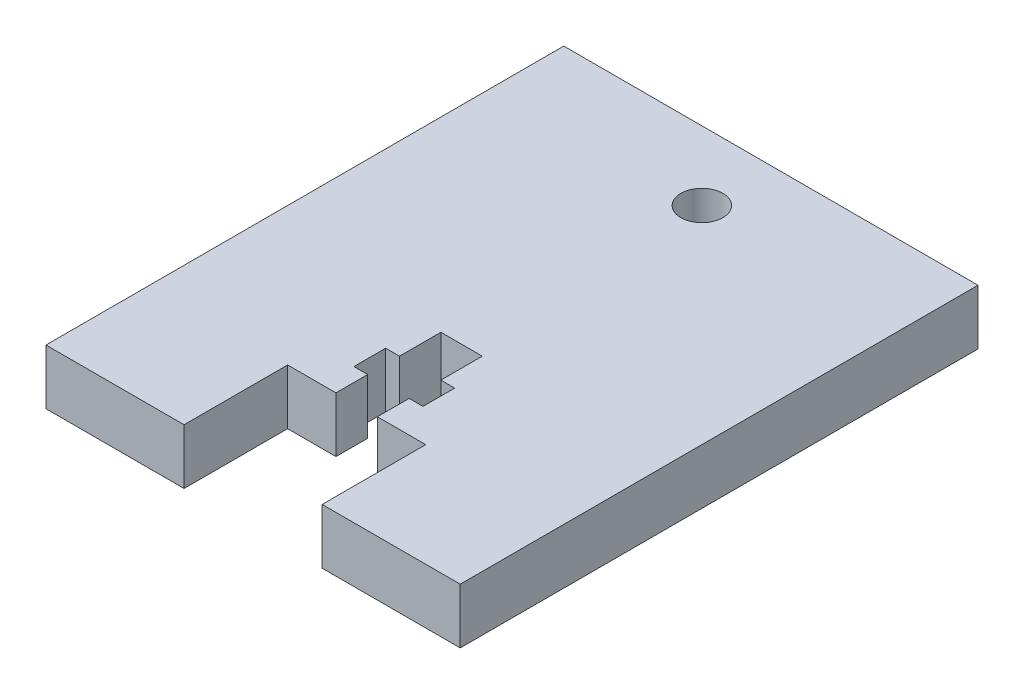
ISO-10303-21;
HEADER;
FILE_DESCRIPTION(('STEP AP214'),'2;1');
FILE_NAME('part.step','',(''),(''),'','','');
FILE_SCHEMA(('AUTOMOTIVE_DESIGN { 1 0 10303 214 1 1 1 1 }'));
ENDSEC;
DATA;
#1=APPLICATION_CONTEXT('core data for automotive mechanical design processes');
#2=APPLICATION_PROTOCOL_DEFINITION('international standard','automotive_design',2000,#1);
#3=PRODUCT_CONTEXT('',#1,'mechanical');
#4=PRODUCT('Part','Part','',(#3));
#5=PRODUCT_RELATED_PRODUCT_CATEGORY('part','',(#4));
#6=PRODUCT_DEFINITION_FORMATION('','',#4);
#7=PRODUCT_DEFINITION_CONTEXT('part definition',#1,'design');
#8=PRODUCT_DEFINITION('design','',#6,#7);
#9=PRODUCT_DEFINITION_SHAPE('','',#8);
#10=(LENGTH_UNIT() NAMED_UNIT(*) SI_UNIT(.MILLI.,.METRE.));
#11=(NAMED_UNIT(*) PLANE_ANGLE_UNIT() SI_UNIT($,.RADIAN.));
#12=(NAMED_UNIT(*) SI_UNIT($,.STERADIAN.) SOLID_ANGLE_UNIT());
#13=UNCERTAINTY_MEASURE_WITH_UNIT(LENGTH_MEASURE(1.E-05),#10,'distance_accuracy_value','');
#14=(GEOMETRIC_REPRESENTATION_CONTEXT(3) GLOBAL_UNCERTAINTY_ASSIGNED_CONTEXT((#13)) GLOBAL_UNIT_ASSIGNED_CONTEXT((#10,
#11,#12)) REPRESENTATION_CONTEXT('',''));
#15=CARTESIAN_POINT('',(0.,0.,0.));
#16=DIRECTION('',(0.,0.,1.));
#17=DIRECTION('',(1.,0.,0.));
#18=AXIS2_PLACEMENT_3D('',#15,#16,#17);
#19=CARTESIAN_POINT('',(0.,8.,0.));
#20=DIRECTION('',(0.,1.,0.));
#21=DIRECTION('',(0.,0.,1.));
#22=AXIS2_PLACEMENT_3D('',#19,#20,#21);
#23=PLANE('',#22);
#24=DIRECTION('',(0.,0.,-1.));
#25=VECTOR('',#24,1.);
#26=CARTESIAN_POINT('',(30.,8.,37.));
#27=LINE('',#26,#25);
#28=CARTESIAN_POINT('',(30.,8.,37.));
#29=VERTEX_POINT('',#28);
#30=CARTESIAN_POINT('',(30.,8.,-38.));
#31=VERTEX_POINT('',#30);
#32=EDGE_CURVE('E241',#29,#31,#27,.T.);
#33=ORIENTED_EDGE('',*,*,#32,.T.);
#34=DIRECTION('',(-1.,0.,0.));
#35=VECTOR('',#34,1.);
#36=CARTESIAN_POINT('',(30.,8.,-38.));
#37=LINE('',#36,#35);
#38=CARTESIAN_POINT('',(-30.,8.,-38.));
#39=VERTEX_POINT('',#38);
#40=EDGE_CURVE('E129',#31,#39,#37,.T.);
#41=ORIENTED_EDGE('',*,*,#40,.T.);
#42=DIRECTION('',(0.,0.,1.));
#43=VECTOR('',#42,1.);
#44=CARTESIAN_POINT('',(-30.,8.,37.));
#45=LINE('',#44,#43);
#46=CARTESIAN_POINT('',(-30.,8.,37.));
#47=VERTEX_POINT('',#46);
#48=EDGE_CURVE('E292',#39,#47,#45,.T.);
#49=ORIENTED_EDGE('',*,*,#48,.T.);
#50=DIRECTION('',(1.,0.,0.));
#51=VECTOR('',#50,1.);
#52=CARTESIAN_POINT('',(-10.,8.,37.));
#53=LINE('',#52,#51);
#54=CARTESIAN_POINT('',(-10.,8.,37.));
#55=VERTEX_POINT('',#54);
#56=EDGE_CURVE('E311',#47,#55,#53,.T.);
#57=ORIENTED_EDGE('',*,*,#56,.T.);
#58=DIRECTION('',(0.,0.,-1.));
#59=VECTOR('',#58,1.);
#60=CARTESIAN_POINT('',(-10.,8.,37.));
#61=LINE('',#60,#59);
#62=CARTESIAN_POINT('',(-10.,8.,22.));
#63=VERTEX_POINT('',#62);
#64=EDGE_CURVE('E308',#55,#63,#61,.T.);
#65=ORIENTED_EDGE('',*,*,#64,.T.);
#66=DIRECTION('',(1.,0.,0.));
#67=VECTOR('',#66,1.);
#68=CARTESIAN_POINT('',(-3.,8.,22.));
#69=LINE('',#68,#67);
#70=CARTESIAN_POINT('',(-3.,8.,22.));
#71=VERTEX_POINT('',#70);
#72=EDGE_CURVE('E310',#63,#71,#69,.T.);
#73=ORIENTED_EDGE('',*,*,#72,.T.);
#74=DIRECTION('',(0.,0.,-1.));
#75=VECTOR('',#74,1.);
#76=CARTESIAN_POINT('',(-3.,8.,17.4));
#77=LINE('',#76,#75);
#78=CARTESIAN_POINT('',(-3.,8.,17.4));
#79=VERTEX_POINT('',#78);
#80=EDGE_CURVE('E313',#71,#79,#77,.T.);
#81=ORIENTED_EDGE('',*,*,#80,.T.);
#82=DIRECTION('',(-1.,0.,0.));
#83=VECTOR('',#82,1.);
#84=CARTESIAN_POINT('',(-5.,8.,17.4));
#85=LINE('',#84,#83);
#86=CARTESIAN_POINT('',(-5.,8.,17.4));
#87=VERTEX_POINT('',#86);
#88=EDGE_CURVE('E319',#79,#87,#85,.T.);
#89=ORIENTED_EDGE('',*,*,#88,.T.);
#90=DIRECTION('',(0.,0.,-1.));
#91=VECTOR('',#90,1.);
#92=CARTESIAN_POINT('',(-5.,8.,12.8));
#93=LINE('',#92,#91);
#94=CARTESIAN_POINT('',(-5.,8.,12.8));
#95=VERTEX_POINT('',#94);
#96=EDGE_CURVE('E321',#87,#95,#93,.T.);
#97=ORIENTED_EDGE('',*,*,#96,.T.);
#98=DIRECTION('',(1.,0.,0.));
#99=VECTOR('',#98,1.);
#100=CARTESIAN_POINT('',(-5.,8.,12.8));
#101=LINE('',#100,#99);
#102=CARTESIAN_POINT('',(-3.,8.,12.8));
#103=VERTEX_POINT('',#102);
#104=EDGE_CURVE('E323',#95,#103,#101,.T.);
#105=ORIENTED_EDGE('',*,*,#104,.T.);
#106=DIRECTION('',(0.,0.,-1.));
#107=VECTOR('',#106,1.);
#108=CARTESIAN_POINT('',(-3.,8.,6.80000000000001));
#109=LINE('',#108,#107);
#110=CARTESIAN_POINT('',(-3.,8.,6.80000000000001));
#111=VERTEX_POINT('',#110);
#112=EDGE_CURVE('E325',#103,#111,#109,.T.);
#113=ORIENTED_EDGE('',*,*,#112,.T.);
#114=DIRECTION('',(1.,0.,0.));
#115=VECTOR('',#114,1.);
#116=CARTESIAN_POINT('',(3.,8.,6.80000000000001));
#117=LINE('',#116,#115);
#118=CARTESIAN_POINT('',(3.,8.,6.80000000000001));
#119=VERTEX_POINT('',#118);
#120=EDGE_CURVE('E327',#111,#119,#117,.T.);
#121=ORIENTED_EDGE('',*,*,#120,.T.);
#122=DIRECTION('',(0.,0.,1.));
#123=VECTOR('',#122,1.);
#124=CARTESIAN_POINT('',(3.,8.,12.8));
#125=LINE('',#124,#123);
#126=CARTESIAN_POINT('',(3.,8.,12.8));
#127=VERTEX_POINT('',#126);
#128=EDGE_CURVE('E329',#119,#127,#125,.T.);
#129=ORIENTED_EDGE('',*,*,#128,.T.);
#130=DIRECTION('',(1.,0.,0.));
#131=VECTOR('',#130,1.);
#132=CARTESIAN_POINT('',(3.,8.,12.8));
#133=LINE('',#132,#131);
#134=CARTESIAN_POINT('',(5.,8.,12.8));
#135=VERTEX_POINT('',#134);
#136=EDGE_CURVE('E331',#127,#135,#133,.T.);
#137=ORIENTED_EDGE('',*,*,#136,.T.);
#138=DIRECTION('',(0.,0.,1.));
#139=VECTOR('',#138,1.);
#140=CARTESIAN_POINT('',(5.,8.,12.8));
#141=LINE('',#140,#139);
#142=CARTESIAN_POINT('',(5.,8.,17.4));
#143=VERTEX_POINT('',#142);
#144=EDGE_CURVE('E333',#135,#143,#141,.T.);
#145=ORIENTED_EDGE('',*,*,#144,.T.);
#146=DIRECTION('',(-1.,0.,0.));
#147=VECTOR('',#146,1.);
#148=CARTESIAN_POINT('',(5.,8.,17.4));
#149=LINE('',#148,#147);
#150=CARTESIAN_POINT('',(3.,8.,17.4));
#151=VERTEX_POINT('',#150);
#152=EDGE_CURVE('E335',#143,#151,#149,.T.);
#153=ORIENTED_EDGE('',*,*,#152,.T.);
#154=DIRECTION('',(0.,0.,1.));
#155=VECTOR('',#154,1.);
#156=CARTESIAN_POINT('',(3.,8.,17.4));
#157=LINE('',#156,#155);
#158=CARTESIAN_POINT('',(3.,8.,22.));
#159=VERTEX_POINT('',#158);
#160=EDGE_CURVE('E184',#151,#159,#157,.T.);
#161=ORIENTED_EDGE('',*,*,#160,.T.);
#162=DIRECTION('',(1.,0.,0.));
#163=VECTOR('',#162,1.);
#164=CARTESIAN_POINT('',(10.,8.,22.));
#165=LINE('',#164,#163);
#166=CARTESIAN_POINT('',(10.,8.,22.));
#167=VERTEX_POINT('',#166);
#168=EDGE_CURVE('E178',#159,#167,#165,.T.);
#169=ORIENTED_EDGE('',*,*,#168,.T.);
#170=DIRECTION('',(0.,0.,1.));
#171=VECTOR('',#170,1.);
#172=CARTESIAN_POINT('',(10.,8.,37.));
#173=LINE('',#172,#171);
#174=CARTESIAN_POINT('',(10.,8.,37.));
#175=VERTEX_POINT('',#174);
#176=EDGE_CURVE('E182',#167,#175,#173,.T.);
#177=ORIENTED_EDGE('',*,*,#176,.T.);
#178=DIRECTION('',(1.,0.,0.));
#179=VECTOR('',#178,1.);
#180=CARTESIAN_POINT('',(10.,8.,37.));
#181=LINE('',#180,#179);
#182=EDGE_CURVE('E50',#175,#29,#181,.T.);
#183=ORIENTED_EDGE('',*,*,#182,.T.);
#184=EDGE_LOOP('',(#33,#41,#49,#57,#65,#73,#81,#89,#97,#105,#113,#121,#129,#137,#145,#153,#161,
#169,#177,#183));
#185=FACE_BOUND('',#184,.T.);
#186=CARTESIAN_POINT('',(0.,8.,-28.));
#187=DIRECTION('',(0.,1.,0.));
#188=DIRECTION('',(0.,0.,1.));
#189=AXIS2_PLACEMENT_3D('',#186,#187,#188);
#190=CIRCLE('',#189,3.05);
#191=CARTESIAN_POINT('',(0.,8.,-24.95));
#192=VERTEX_POINT('',#191);
#193=EDGE_CURVE('E206',#192,#192,#190,.T.);
#194=ORIENTED_EDGE('',*,*,#193,.F.);
#195=EDGE_LOOP('',(#194));
#196=FACE_BOUND('',#195,.T.);
#197=ADVANCED_FACE('F33',(#185,#196),#23,.T.);
#198=CARTESIAN_POINT('',(0.,0.,0.));
#199=DIRECTION('',(0.,1.,0.));
#200=DIRECTION('',(0.,0.,1.));
#201=AXIS2_PLACEMENT_3D('',#198,#199,#200);
#202=PLANE('',#201);
#203=DIRECTION('',(0.,0.,-1.));
#204=VECTOR('',#203,1.);
#205=CARTESIAN_POINT('',(30.,0.,37.));
#206=LINE('',#205,#204);
#207=CARTESIAN_POINT('',(30.,0.,37.));
#208=VERTEX_POINT('',#207);
#209=CARTESIAN_POINT('',(30.,0.,-38.));
#210=VERTEX_POINT('',#209);
#211=EDGE_CURVE('E202',#208,#210,#206,.T.);
#212=ORIENTED_EDGE('',*,*,#211,.F.);
#213=DIRECTION('',(1.,0.,0.));
#214=VECTOR('',#213,1.);
#215=CARTESIAN_POINT('',(10.,0.,37.));
#216=LINE('',#215,#214);
#217=CARTESIAN_POINT('',(10.,0.,37.));
#218=VERTEX_POINT('',#217);
#219=EDGE_CURVE('E121',#218,#208,#216,.T.);
#220=ORIENTED_EDGE('',*,*,#219,.F.);
#221=DIRECTION('',(0.,0.,1.));
#222=VECTOR('',#221,1.);
#223=CARTESIAN_POINT('',(10.,0.,37.));
#224=LINE('',#223,#222);
#225=CARTESIAN_POINT('',(10.,0.,22.));
#226=VERTEX_POINT('',#225);
#227=EDGE_CURVE('E115',#226,#218,#224,.T.);
#228=ORIENTED_EDGE('',*,*,#227,.F.);
#229=DIRECTION('',(1.,0.,0.));
#230=VECTOR('',#229,1.);
#231=CARTESIAN_POINT('',(10.,0.,22.));
#232=LINE('',#231,#230);
#233=CARTESIAN_POINT('',(3.,0.,22.));
#234=VERTEX_POINT('',#233);
#235=EDGE_CURVE('E192',#234,#226,#232,.T.);
#236=ORIENTED_EDGE('',*,*,#235,.F.);
#237=DIRECTION('',(0.,0.,1.));
#238=VECTOR('',#237,1.);
#239=CARTESIAN_POINT('',(3.,0.,17.4));
#240=LINE('',#239,#238);
#241=CARTESIAN_POINT('',(3.,0.,17.4));
#242=VERTEX_POINT('',#241);
#243=EDGE_CURVE('E236',#242,#234,#240,.T.);
#244=ORIENTED_EDGE('',*,*,#243,.F.);
#245=DIRECTION('',(-1.,0.,0.));
#246=VECTOR('',#245,1.);
#247=CARTESIAN_POINT('',(5.,0.,17.4));
#248=LINE('',#247,#246);
#249=CARTESIAN_POINT('',(5.,0.,17.4));
#250=VERTEX_POINT('',#249);
#251=EDGE_CURVE('E234',#250,#242,#248,.T.);
#252=ORIENTED_EDGE('',*,*,#251,.F.);
#253=DIRECTION('',(0.,0.,1.));
#254=VECTOR('',#253,1.);
#255=CARTESIAN_POINT('',(5.,0.,12.8));
#256=LINE('',#255,#254);
#257=CARTESIAN_POINT('',(5.,0.,12.8));
#258=VERTEX_POINT('',#257);
#259=EDGE_CURVE('E232',#258,#250,#256,.T.);
#260=ORIENTED_EDGE('',*,*,#259,.F.);
#261=DIRECTION('',(1.,0.,0.));
#262=VECTOR('',#261,1.);
#263=CARTESIAN_POINT('',(3.,0.,12.8));
#264=LINE('',#263,#262);
#265=CARTESIAN_POINT('',(3.,0.,12.8));
#266=VERTEX_POINT('',#265);
#267=EDGE_CURVE('E230',#266,#258,#264,.T.);
#268=ORIENTED_EDGE('',*,*,#267,.F.);
#269=DIRECTION('',(0.,0.,1.));
#270=VECTOR('',#269,1.);
#271=CARTESIAN_POINT('',(3.,0.,12.8));
#272=LINE('',#271,#270);
#273=CARTESIAN_POINT('',(3.,0.,6.80000000000001));
#274=VERTEX_POINT('',#273);
#275=EDGE_CURVE('E228',#274,#266,#272,.T.);
#276=ORIENTED_EDGE('',*,*,#275,.F.);
#277=DIRECTION('',(1.,0.,0.));
#278=VECTOR('',#277,1.);
#279=CARTESIAN_POINT('',(3.,0.,6.80000000000001));
#280=LINE('',#279,#278);
#281=CARTESIAN_POINT('',(-3.,0.,6.80000000000001));
#282=VERTEX_POINT('',#281);
#283=EDGE_CURVE('E226',#282,#274,#280,.T.);
#284=ORIENTED_EDGE('',*,*,#283,.F.);
#285=DIRECTION('',(0.,0.,-1.));
#286=VECTOR('',#285,1.);
#287=CARTESIAN_POINT('',(-3.,0.,6.80000000000001));
#288=LINE('',#287,#286);
#289=CARTESIAN_POINT('',(-3.,0.,12.8));
#290=VERTEX_POINT('',#289);
#291=EDGE_CURVE('E224',#290,#282,#288,.T.);
#292=ORIENTED_EDGE('',*,*,#291,.F.);
#293=DIRECTION('',(1.,0.,0.));
#294=VECTOR('',#293,1.);
#295=CARTESIAN_POINT('',(-5.,0.,12.8));
#296=LINE('',#295,#294);
#297=CARTESIAN_POINT('',(-5.,0.,12.8));
#298=VERTEX_POINT('',#297);
#299=EDGE_CURVE('E222',#298,#290,#296,.T.);
#300=ORIENTED_EDGE('',*,*,#299,.F.);
#301=DIRECTION('',(0.,0.,-1.));
#302=VECTOR('',#301,1.);
#303=CARTESIAN_POINT('',(-5.,0.,12.8));
#304=LINE('',#303,#302);
#305=CARTESIAN_POINT('',(-5.,0.,17.4));
#306=VERTEX_POINT('',#305);
#307=EDGE_CURVE('E220',#306,#298,#304,.T.);
#308=ORIENTED_EDGE('',*,*,#307,.F.);
#309=DIRECTION('',(-1.,0.,0.));
#310=VECTOR('',#309,1.);
#311=CARTESIAN_POINT('',(-5.,0.,17.4));
#312=LINE('',#311,#310);
#313=CARTESIAN_POINT('',(-3.,0.,17.4));
#314=VERTEX_POINT('',#313);
#315=EDGE_CURVE('E218',#314,#306,#312,.T.);
#316=ORIENTED_EDGE('',*,*,#315,.F.);
#317=DIRECTION('',(0.,0.,-1.));
#318=VECTOR('',#317,1.);
#319=CARTESIAN_POINT('',(-3.,0.,17.4));
#320=LINE('',#319,#318);
#321=CARTESIAN_POINT('',(-3.,0.,22.));
#322=VERTEX_POINT('',#321);
#323=EDGE_CURVE('E216',#322,#314,#320,.T.);
#324=ORIENTED_EDGE('',*,*,#323,.F.);
#325=DIRECTION('',(1.,0.,0.));
#326=VECTOR('',#325,1.);
#327=CARTESIAN_POINT('',(-3.,0.,22.));
#328=LINE('',#327,#326);
#329=CARTESIAN_POINT('',(-10.,0.,22.));
#330=VERTEX_POINT('',#329);
#331=EDGE_CURVE('E214',#330,#322,#328,.T.);
#332=ORIENTED_EDGE('',*,*,#331,.F.);
#333=DIRECTION('',(0.,0.,-1.));
#334=VECTOR('',#333,1.);
#335=CARTESIAN_POINT('',(-10.,0.,37.));
#336=LINE('',#335,#334);
#337=CARTESIAN_POINT('',(-10.,0.,37.));
#338=VERTEX_POINT('',#337);
#339=EDGE_CURVE('E212',#338,#330,#336,.T.);
#340=ORIENTED_EDGE('',*,*,#339,.F.);
#341=DIRECTION('',(1.,0.,0.));
#342=VECTOR('',#341,1.);
#343=CARTESIAN_POINT('',(-10.,0.,37.));
#344=LINE('',#343,#342);
#345=CARTESIAN_POINT('',(-30.,0.,37.));
#346=VERTEX_POINT('',#345);
#347=EDGE_CURVE('E210',#346,#338,#344,.T.);
#348=ORIENTED_EDGE('',*,*,#347,.F.);
#349=DIRECTION('',(0.,0.,1.));
#350=VECTOR('',#349,1.);
#351=CARTESIAN_POINT('',(-30.,0.,37.));
#352=LINE('',#351,#350);
#353=CARTESIAN_POINT('',(-30.,0.,-38.));
#354=VERTEX_POINT('',#353);
#355=EDGE_CURVE('E208',#354,#346,#352,.T.);
#356=ORIENTED_EDGE('',*,*,#355,.F.);
#357=DIRECTION('',(-1.,0.,0.));
#358=VECTOR('',#357,1.);
#359=CARTESIAN_POINT('',(30.,0.,-38.));
#360=LINE('',#359,#358);
#361=EDGE_CURVE('E205',#210,#354,#360,.T.);
#362=ORIENTED_EDGE('',*,*,#361,.F.);
#363=EDGE_LOOP('',(#212,#220,#228,#236,#244,#252,#260,#268,#276,#284,#292,#300,#308,#316,#324,
#332,#340,#348,#356,#362));
#364=FACE_BOUND('',#363,.T.);
#365=CARTESIAN_POINT('',(0.,0.,-28.));
#366=DIRECTION('',(0.,1.,0.));
#367=DIRECTION('',(0.,0.,1.));
#368=AXIS2_PLACEMENT_3D('',#365,#366,#367);
#369=CIRCLE('',#368,3.05);
#370=CARTESIAN_POINT('',(0.,0.,-24.95));
#371=VERTEX_POINT('',#370);
#372=EDGE_CURVE('E586',#371,#371,#369,.T.);
#373=ORIENTED_EDGE('',*,*,#372,.T.);
#374=EDGE_LOOP('',(#373));
#375=FACE_BOUND('',#374,.T.);
#376=ADVANCED_FACE('F296',(#364,#375),#202,.F.);
#377=CARTESIAN_POINT('',(30.,8.,37.));
#378=DIRECTION('',(-1.,0.,0.));
#379=DIRECTION('',(0.,0.,1.));
#380=AXIS2_PLACEMENT_3D('',#377,#378,#379);
#381=PLANE('',#380);
#382=ORIENTED_EDGE('',*,*,#211,.T.);
#383=DIRECTION('',(0.,-1.,0.));
#384=VECTOR('',#383,1.);
#385=CARTESIAN_POINT('',(30.,8.,-38.));
#386=LINE('',#385,#384);
#387=EDGE_CURVE('E11',#31,#210,#386,.T.);
#388=ORIENTED_EDGE('',*,*,#387,.F.);
#389=ORIENTED_EDGE('',*,*,#32,.F.);
#390=DIRECTION('',(0.,-1.,0.));
#391=VECTOR('',#390,1.);
#392=CARTESIAN_POINT('',(30.,8.,37.));
#393=LINE('',#392,#391);
#394=EDGE_CURVE('E198',#29,#208,#393,.T.);
#395=ORIENTED_EDGE('',*,*,#394,.T.);
#396=EDGE_LOOP('',(#382,#388,#389,#395));
#397=FACE_BOUND('',#396,.T.);
#398=ADVANCED_FACE('F35',(#397),#381,.F.);
#399=CARTESIAN_POINT('',(30.,8.,-38.));
#400=DIRECTION('',(0.,0.,1.));
#401=DIRECTION('',(1.,0.,0.));
#402=AXIS2_PLACEMENT_3D('',#399,#400,#401);
#403=PLANE('',#402);
#404=ORIENTED_EDGE('',*,*,#361,.T.);
#405=DIRECTION('',(0.,-1.,0.));
#406=VECTOR('',#405,1.);
#407=CARTESIAN_POINT('',(-30.,8.,-38.));
#408=LINE('',#407,#406);
#409=EDGE_CURVE('E42',#39,#354,#408,.T.);
#410=ORIENTED_EDGE('',*,*,#409,.F.);
#411=ORIENTED_EDGE('',*,*,#40,.F.);
#412=ORIENTED_EDGE('',*,*,#387,.T.);
#413=EDGE_LOOP('',(#404,#410,#411,#412));
#414=FACE_BOUND('',#413,.T.);
#415=ADVANCED_FACE('F369',(#414),#403,.F.);
#416=CARTESIAN_POINT('',(-30.,8.,37.));
#417=DIRECTION('',(1.,0.,0.));
#418=DIRECTION('',(0.,0.,-1.));
#419=AXIS2_PLACEMENT_3D('',#416,#417,#418);
#420=PLANE('',#419);
#421=ORIENTED_EDGE('',*,*,#355,.T.);
#422=DIRECTION('',(0.,-1.,0.));
#423=VECTOR('',#422,1.);
#424=CARTESIAN_POINT('',(-30.,8.,37.));
#425=LINE('',#424,#423);
#426=EDGE_CURVE('E284',#47,#346,#425,.T.);
#427=ORIENTED_EDGE('',*,*,#426,.F.);
#428=ORIENTED_EDGE('',*,*,#48,.F.);
#429=ORIENTED_EDGE('',*,*,#409,.T.);
#430=EDGE_LOOP('',(#421,#427,#428,#429));
#431=FACE_BOUND('',#430,.T.);
#432=ADVANCED_FACE('F290',(#431),#420,.F.);
#433=CARTESIAN_POINT('',(-10.,8.,37.));
#434=DIRECTION('',(0.,0.,-1.));
#435=DIRECTION('',(-1.,0.,0.));
#436=AXIS2_PLACEMENT_3D('',#433,#434,#435);
#437=PLANE('',#436);
#438=ORIENTED_EDGE('',*,*,#347,.T.);
#439=DIRECTION('',(0.,-1.,0.));
#440=VECTOR('',#439,1.);
#441=CARTESIAN_POINT('',(-10.,8.,37.));
#442=LINE('',#441,#440);
#443=EDGE_CURVE('E281',#55,#338,#442,.T.);
#444=ORIENTED_EDGE('',*,*,#443,.F.);
#445=ORIENTED_EDGE('',*,*,#56,.F.);
#446=ORIENTED_EDGE('',*,*,#426,.T.);
#447=EDGE_LOOP('',(#438,#444,#445,#446));
#448=FACE_BOUND('',#447,.T.);
#449=ADVANCED_FACE('F302',(#448),#437,.F.);
#450=CARTESIAN_POINT('',(-10.,8.,37.));
#451=DIRECTION('',(-1.,0.,0.));
#452=DIRECTION('',(0.,0.,1.));
#453=AXIS2_PLACEMENT_3D('',#450,#451,#452);
#454=PLANE('',#453);
#455=ORIENTED_EDGE('',*,*,#339,.T.);
#456=DIRECTION('',(0.,-1.,0.));
#457=VECTOR('',#456,1.);
#458=CARTESIAN_POINT('',(-10.,8.,22.));
#459=LINE('',#458,#457);
#460=EDGE_CURVE('E278',#63,#330,#459,.T.);
#461=ORIENTED_EDGE('',*,*,#460,.F.);
#462=ORIENTED_EDGE('',*,*,#64,.F.);
#463=ORIENTED_EDGE('',*,*,#443,.T.);
#464=EDGE_LOOP('',(#455,#461,#462,#463));
#465=FACE_BOUND('',#464,.T.);
#466=ADVANCED_FACE('F306',(#465),#454,.F.);
#467=CARTESIAN_POINT('',(-3.,8.,22.));
#468=DIRECTION('',(0.,0.,-1.));
#469=DIRECTION('',(-1.,0.,0.));
#470=AXIS2_PLACEMENT_3D('',#467,#468,#469);
#471=PLANE('',#470);
#472=ORIENTED_EDGE('',*,*,#331,.T.);
#473=DIRECTION('',(0.,-1.,0.));
#474=VECTOR('',#473,1.);
#475=CARTESIAN_POINT('',(-3.,8.,22.));
#476=LINE('',#475,#474);
#477=EDGE_CURVE('E275',#71,#322,#476,.T.);
#478=ORIENTED_EDGE('',*,*,#477,.F.);
#479=ORIENTED_EDGE('',*,*,#72,.F.);
#480=ORIENTED_EDGE('',*,*,#460,.T.);
#481=EDGE_LOOP('',(#472,#478,#479,#480));
#482=FACE_BOUND('',#481,.T.);
#483=ADVANCED_FACE('F382',(#482),#471,.F.);
#484=CARTESIAN_POINT('',(-3.,8.,17.4));
#485=DIRECTION('',(-1.,0.,0.));
#486=DIRECTION('',(0.,0.,1.));
#487=AXIS2_PLACEMENT_3D('',#484,#485,#486);
#488=PLANE('',#487);
#489=ORIENTED_EDGE('',*,*,#323,.T.);
#490=DIRECTION('',(0.,-1.,0.));
#491=VECTOR('',#490,1.);
#492=CARTESIAN_POINT('',(-3.,8.,17.4));
#493=LINE('',#492,#491);
#494=EDGE_CURVE('E272',#79,#314,#493,.T.);
#495=ORIENTED_EDGE('',*,*,#494,.F.);
#496=ORIENTED_EDGE('',*,*,#80,.F.);
#497=ORIENTED_EDGE('',*,*,#477,.T.);
#498=EDGE_LOOP('',(#489,#495,#496,#497));
#499=FACE_BOUND('',#498,.T.);
#500=ADVANCED_FACE('F385',(#499),#488,.F.);
#501=CARTESIAN_POINT('',(-5.,8.,17.4));
#502=DIRECTION('',(0.,0.,1.));
#503=DIRECTION('',(1.,0.,0.));
#504=AXIS2_PLACEMENT_3D('',#501,#502,#503);
#505=PLANE('',#504);
#506=ORIENTED_EDGE('',*,*,#315,.T.);
#507=DIRECTION('',(0.,-1.,0.));
#508=VECTOR('',#507,1.);
#509=CARTESIAN_POINT('',(-5.,8.,17.4));
#510=LINE('',#509,#508);
#511=EDGE_CURVE('E269',#87,#306,#510,.T.);
#512=ORIENTED_EDGE('',*,*,#511,.F.);
#513=ORIENTED_EDGE('',*,*,#88,.F.);
#514=ORIENTED_EDGE('',*,*,#494,.T.);
#515=EDGE_LOOP('',(#506,#512,#513,#514));
#516=FACE_BOUND('',#515,.T.);
#517=ADVANCED_FACE('F389',(#516),#505,.F.);
#518=CARTESIAN_POINT('',(-5.,8.,12.8));
#519=DIRECTION('',(-1.,0.,0.));
#520=DIRECTION('',(0.,0.,1.));
#521=AXIS2_PLACEMENT_3D('',#518,#519,#520);
#522=PLANE('',#521);
#523=ORIENTED_EDGE('',*,*,#307,.T.);
#524=DIRECTION('',(0.,-1.,0.));
#525=VECTOR('',#524,1.);
#526=CARTESIAN_POINT('',(-5.,8.,12.8));
#527=LINE('',#526,#525);
#528=EDGE_CURVE('E266',#95,#298,#527,.T.);
#529=ORIENTED_EDGE('',*,*,#528,.F.);
#530=ORIENTED_EDGE('',*,*,#96,.F.);
#531=ORIENTED_EDGE('',*,*,#511,.T.);
#532=EDGE_LOOP('',(#523,#529,#530,#531));
#533=FACE_BOUND('',#532,.T.);
#534=ADVANCED_FACE('F393',(#533),#522,.F.);
#535=CARTESIAN_POINT('',(-5.,8.,12.8));
#536=DIRECTION('',(0.,0.,-1.));
#537=DIRECTION('',(-1.,0.,0.));
#538=AXIS2_PLACEMENT_3D('',#535,#536,#537);
#539=PLANE('',#538);
#540=ORIENTED_EDGE('',*,*,#299,.T.);
#541=DIRECTION('',(0.,-1.,0.));
#542=VECTOR('',#541,1.);
#543=CARTESIAN_POINT('',(-3.,8.,12.8));
#544=LINE('',#543,#542);
#545=EDGE_CURVE('E263',#103,#290,#544,.T.);
#546=ORIENTED_EDGE('',*,*,#545,.F.);
#547=ORIENTED_EDGE('',*,*,#104,.F.);
#548=ORIENTED_EDGE('',*,*,#528,.T.);
#549=EDGE_LOOP('',(#540,#546,#547,#548));
#550=FACE_BOUND('',#549,.T.);
#551=ADVANCED_FACE('F397',(#550),#539,.F.);
#552=CARTESIAN_POINT('',(-3.,8.,6.80000000000001));
#553=DIRECTION('',(-1.,0.,0.));
#554=DIRECTION('',(0.,0.,1.));
#555=AXIS2_PLACEMENT_3D('',#552,#553,#554);
#556=PLANE('',#555);
#557=ORIENTED_EDGE('',*,*,#291,.T.);
#558=DIRECTION('',(0.,-1.,0.));
#559=VECTOR('',#558,1.);
#560=CARTESIAN_POINT('',(-3.,8.,6.80000000000001));
#561=LINE('',#560,#559);
#562=EDGE_CURVE('E260',#111,#282,#561,.T.);
#563=ORIENTED_EDGE('',*,*,#562,.F.);
#564=ORIENTED_EDGE('',*,*,#112,.F.);
#565=ORIENTED_EDGE('',*,*,#545,.T.);
#566=EDGE_LOOP('',(#557,#563,#564,#565));
#567=FACE_BOUND('',#566,.T.);
#568=ADVANCED_FACE('F401',(#567),#556,.F.);
#569=CARTESIAN_POINT('',(3.,8.,6.80000000000001));
#570=DIRECTION('',(0.,0.,-1.));
#571=DIRECTION('',(-1.,0.,0.));
#572=AXIS2_PLACEMENT_3D('',#569,#570,#571);
#573=PLANE('',#572);
#574=ORIENTED_EDGE('',*,*,#283,.T.);
#575=DIRECTION('',(0.,-1.,0.));
#576=VECTOR('',#575,1.);
#577=CARTESIAN_POINT('',(3.,8.,6.80000000000001));
#578=LINE('',#577,#576);
#579=EDGE_CURVE('E257',#119,#274,#578,.T.);
#580=ORIENTED_EDGE('',*,*,#579,.F.);
#581=ORIENTED_EDGE('',*,*,#120,.F.);
#582=ORIENTED_EDGE('',*,*,#562,.T.);
#583=EDGE_LOOP('',(#574,#580,#581,#582));
#584=FACE_BOUND('',#583,.T.);
#585=ADVANCED_FACE('F405',(#584),#573,.F.);
#586=CARTESIAN_POINT('',(3.,8.,12.8));
#587=DIRECTION('',(1.,0.,0.));
#588=DIRECTION('',(0.,0.,-1.));
#589=AXIS2_PLACEMENT_3D('',#586,#587,#588);
#590=PLANE('',#589);
#591=ORIENTED_EDGE('',*,*,#275,.T.);
#592=DIRECTION('',(0.,-1.,0.));
#593=VECTOR('',#592,1.);
#594=CARTESIAN_POINT('',(3.,8.,12.8));
#595=LINE('',#594,#593);
#596=EDGE_CURVE('E254',#127,#266,#595,.T.);
#597=ORIENTED_EDGE('',*,*,#596,.F.);
#598=ORIENTED_EDGE('',*,*,#128,.F.);
#599=ORIENTED_EDGE('',*,*,#579,.T.);
#600=EDGE_LOOP('',(#591,#597,#598,#599));
#601=FACE_BOUND('',#600,.T.);
#602=ADVANCED_FACE('F409',(#601),#590,.F.);
#603=CARTESIAN_POINT('',(3.,8.,12.8));
#604=DIRECTION('',(0.,0.,-1.));
#605=DIRECTION('',(-1.,0.,0.));
#606=AXIS2_PLACEMENT_3D('',#603,#604,#605);
#607=PLANE('',#606);
#608=ORIENTED_EDGE('',*,*,#267,.T.);
#609=DIRECTION('',(0.,-1.,0.));
#610=VECTOR('',#609,1.);
#611=CARTESIAN_POINT('',(5.,8.,12.8));
#612=LINE('',#611,#610);
#613=EDGE_CURVE('E251',#135,#258,#612,.T.);
#614=ORIENTED_EDGE('',*,*,#613,.F.);
#615=ORIENTED_EDGE('',*,*,#136,.F.);
#616=ORIENTED_EDGE('',*,*,#596,.T.);
#617=EDGE_LOOP('',(#608,#614,#615,#616));
#618=FACE_BOUND('',#617,.T.);
#619=ADVANCED_FACE('F413',(#618),#607,.F.);
#620=CARTESIAN_POINT('',(5.,8.,12.8));
#621=DIRECTION('',(1.,0.,0.));
#622=DIRECTION('',(0.,0.,-1.));
#623=AXIS2_PLACEMENT_3D('',#620,#621,#622);
#624=PLANE('',#623);
#625=ORIENTED_EDGE('',*,*,#259,.T.);
#626=DIRECTION('',(0.,-1.,0.));
#627=VECTOR('',#626,1.);
#628=CARTESIAN_POINT('',(5.,8.,17.4));
#629=LINE('',#628,#627);
#630=EDGE_CURVE('E248',#143,#250,#629,.T.);
#631=ORIENTED_EDGE('',*,*,#630,.F.);
#632=ORIENTED_EDGE('',*,*,#144,.F.);
#633=ORIENTED_EDGE('',*,*,#613,.T.);
#634=EDGE_LOOP('',(#625,#631,#632,#633));
#635=FACE_BOUND('',#634,.T.);
#636=ADVANCED_FACE('F417',(#635),#624,.F.);
#637=CARTESIAN_POINT('',(5.,8.,17.4));
#638=DIRECTION('',(0.,0.,1.));
#639=DIRECTION('',(1.,0.,0.));
#640=AXIS2_PLACEMENT_3D('',#637,#638,#639);
#641=PLANE('',#640);
#642=ORIENTED_EDGE('',*,*,#251,.T.);
#643=DIRECTION('',(0.,-1.,0.));
#644=VECTOR('',#643,1.);
#645=CARTESIAN_POINT('',(3.,8.,17.4));
#646=LINE('',#645,#644);
#647=EDGE_CURVE('E245',#151,#242,#646,.T.);
#648=ORIENTED_EDGE('',*,*,#647,.F.);
#649=ORIENTED_EDGE('',*,*,#152,.F.);
#650=ORIENTED_EDGE('',*,*,#630,.T.);
#651=EDGE_LOOP('',(#642,#648,#649,#650));
#652=FACE_BOUND('',#651,.T.);
#653=ADVANCED_FACE('F341',(#652),#641,.F.);
#654=CARTESIAN_POINT('',(3.,8.,17.4));
#655=DIRECTION('',(1.,0.,0.));
#656=DIRECTION('',(0.,0.,-1.));
#657=AXIS2_PLACEMENT_3D('',#654,#655,#656);
#658=PLANE('',#657);
#659=ORIENTED_EDGE('',*,*,#243,.T.);
#660=DIRECTION('',(0.,-1.,0.));
#661=VECTOR('',#660,1.);
#662=CARTESIAN_POINT('',(3.,8.,22.));
#663=LINE('',#662,#661);
#664=EDGE_CURVE('E193',#159,#234,#663,.T.);
#665=ORIENTED_EDGE('',*,*,#664,.F.);
#666=ORIENTED_EDGE('',*,*,#160,.F.);
#667=ORIENTED_EDGE('',*,*,#647,.T.);
#668=EDGE_LOOP('',(#659,#665,#666,#667));
#669=FACE_BOUND('',#668,.T.);
#670=ADVANCED_FACE('F345',(#669),#658,.F.);
#671=CARTESIAN_POINT('',(10.,8.,22.));
#672=DIRECTION('',(0.,0.,-1.));
#673=DIRECTION('',(-1.,0.,0.));
#674=AXIS2_PLACEMENT_3D('',#671,#672,#673);
#675=PLANE('',#674);
#676=ORIENTED_EDGE('',*,*,#235,.T.);
#677=DIRECTION('',(0.,-1.,0.));
#678=VECTOR('',#677,1.);
#679=CARTESIAN_POINT('',(10.,8.,22.));
#680=LINE('',#679,#678);
#681=EDGE_CURVE('E189',#167,#226,#680,.T.);
#682=ORIENTED_EDGE('',*,*,#681,.F.);
#683=ORIENTED_EDGE('',*,*,#168,.F.);
#684=ORIENTED_EDGE('',*,*,#664,.T.);
#685=EDGE_LOOP('',(#676,#682,#683,#684));
#686=FACE_BOUND('',#685,.T.);
#687=ADVANCED_FACE('F190',(#686),#675,.F.);
#688=CARTESIAN_POINT('',(10.,8.,37.));
#689=DIRECTION('',(1.,0.,0.));
#690=DIRECTION('',(0.,0.,-1.));
#691=AXIS2_PLACEMENT_3D('',#688,#689,#690);
#692=PLANE('',#691);
#693=ORIENTED_EDGE('',*,*,#227,.T.);
#694=DIRECTION('',(0.,-1.,0.));
#695=VECTOR('',#694,1.);
#696=CARTESIAN_POINT('',(10.,8.,37.));
#697=LINE('',#696,#695);
#698=EDGE_CURVE('E194',#175,#218,#697,.T.);
#699=ORIENTED_EDGE('',*,*,#698,.F.);
#700=ORIENTED_EDGE('',*,*,#176,.F.);
#701=ORIENTED_EDGE('',*,*,#681,.T.);
#702=EDGE_LOOP('',(#693,#699,#700,#701));
#703=FACE_BOUND('',#702,.T.);
#704=ADVANCED_FACE('F196',(#703),#692,.F.);
#705=CARTESIAN_POINT('',(10.,8.,37.));
#706=DIRECTION('',(0.,0.,-1.));
#707=DIRECTION('',(-1.,0.,0.));
#708=AXIS2_PLACEMENT_3D('',#705,#706,#707);
#709=PLANE('',#708);
#710=ORIENTED_EDGE('',*,*,#219,.T.);
#711=ORIENTED_EDGE('',*,*,#394,.F.);
#712=ORIENTED_EDGE('',*,*,#182,.F.);
#713=ORIENTED_EDGE('',*,*,#698,.T.);
#714=EDGE_LOOP('',(#710,#711,#712,#713));
#715=FACE_BOUND('',#714,.T.);
#716=ADVANCED_FACE('F349',(#715),#709,.F.);
#717=CARTESIAN_POINT('',(0.,8.,-28.));
#718=DIRECTION('',(0.,-1.,0.));
#719=DIRECTION('',(0.,0.,-1.));
#720=AXIS2_PLACEMENT_3D('',#717,#718,#719);
#721=CYLINDRICAL_SURFACE('',#720,3.05);
#722=ORIENTED_EDGE('',*,*,#193,.T.);
#723=EDGE_LOOP('',(#722));
#724=FACE_BOUND('',#723,.T.);
#725=ORIENTED_EDGE('',*,*,#372,.F.);
#726=EDGE_LOOP('',(#725));
#727=FACE_BOUND('',#726,.T.);
#728=ADVANCED_FACE('F351',(#724,#727),#721,.F.);
#729=CLOSED_SHELL('',(#197,#376,#398,#415,#432,#449,#466,#483,#500,#517,#534,#551,#568,#585,
#602,#619,#636,#653,#670,#687,#704,#716,#728));
#730=MANIFOLD_SOLID_BREP('B2',#729);
#731=ADVANCED_BREP_SHAPE_REPRESENTATION('',(#18,#730),#14);
#732=SHAPE_DEFINITION_REPRESENTATION(#9,#731);
ENDSEC;
END-ISO-10303-21;
